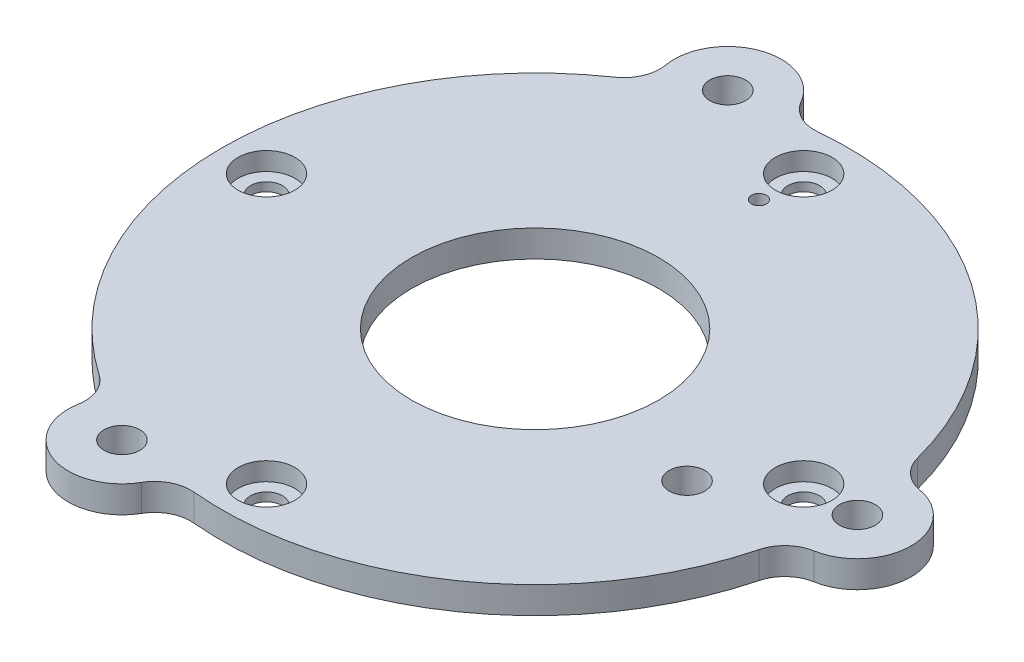
ISO-10303-21;
HEADER;
FILE_DESCRIPTION(('STEP AP214'),'2;1');
FILE_NAME('part.step','',(''),(''),'','','');
FILE_SCHEMA(('AUTOMOTIVE_DESIGN { 1 0 10303 214 1 1 1 1 }'));
ENDSEC;
DATA;
#1=APPLICATION_CONTEXT('core data for automotive mechanical design processes');
#2=APPLICATION_PROTOCOL_DEFINITION('international standard','automotive_design',2000,#1);
#3=PRODUCT_CONTEXT('',#1,'mechanical');
#4=PRODUCT('Part','Part','',(#3));
#5=PRODUCT_RELATED_PRODUCT_CATEGORY('part','',(#4));
#6=PRODUCT_DEFINITION_FORMATION('','',#4);
#7=PRODUCT_DEFINITION_CONTEXT('part definition',#1,'design');
#8=PRODUCT_DEFINITION('design','',#6,#7);
#9=PRODUCT_DEFINITION_SHAPE('','',#8);
#10=(LENGTH_UNIT() NAMED_UNIT(*) SI_UNIT(.MILLI.,.METRE.));
#11=(NAMED_UNIT(*) PLANE_ANGLE_UNIT() SI_UNIT($,.RADIAN.));
#12=(NAMED_UNIT(*) SI_UNIT($,.STERADIAN.) SOLID_ANGLE_UNIT());
#13=UNCERTAINTY_MEASURE_WITH_UNIT(LENGTH_MEASURE(1.E-05),#10,'distance_accuracy_value','');
#14=(GEOMETRIC_REPRESENTATION_CONTEXT(3) GLOBAL_UNCERTAINTY_ASSIGNED_CONTEXT((#13)) GLOBAL_UNIT_ASSIGNED_CONTEXT((#10,
#11,#12)) REPRESENTATION_CONTEXT('',''));
#15=CARTESIAN_POINT('',(0.,0.,0.));
#16=DIRECTION('',(0.,0.,1.));
#17=DIRECTION('',(1.,0.,0.));
#18=AXIS2_PLACEMENT_3D('',#15,#16,#17);
#19=CARTESIAN_POINT('',(0.,1.5,0.));
#20=DIRECTION('',(0.,-1.,0.));
#21=DIRECTION('',(0.,0.,-1.));
#22=AXIS2_PLACEMENT_3D('',#19,#20,#21);
#23=CYLINDRICAL_SURFACE('',#22,17.5);
#24=CARTESIAN_POINT('',(0.,0.,0.));
#25=DIRECTION('',(0.,1.,0.));
#26=DIRECTION('',(0.,0.,1.));
#27=AXIS2_PLACEMENT_3D('',#24,#25,#26);
#28=CIRCLE('',#27,17.5);
#29=CARTESIAN_POINT('',(-1.63884490753952,0.,17.423093507441));
#30=VERTEX_POINT('',#29);
#31=CARTESIAN_POINT('',(16.9328703703704,0.,4.419038472364));
#32=VERTEX_POINT('',#31);
#33=EDGE_CURVE('E182',#30,#32,#28,.T.);
#34=ORIENTED_EDGE('',*,*,#33,.T.);
#35=DIRECTION('',(0.,-1.,0.));
#36=VECTOR('',#35,1.);
#37=CARTESIAN_POINT('',(16.9328703703704,1.5,4.419038472364));
#38=LINE('',#37,#36);
#39=CARTESIAN_POINT('',(16.9328703703704,1.5,4.419038472364));
#40=VERTEX_POINT('',#39);
#41=EDGE_CURVE('E216',#32,#40,#38,.F.);
#42=ORIENTED_EDGE('',*,*,#41,.T.);
#43=CARTESIAN_POINT('',(0.,1.5,0.));
#44=DIRECTION('',(0.,1.,0.));
#45=DIRECTION('',(0.,0.,1.));
#46=AXIS2_PLACEMENT_3D('',#43,#44,#45);
#47=CIRCLE('',#46,17.5);
#48=CARTESIAN_POINT('',(-1.63884490753952,1.5,17.423093507441));
#49=VERTEX_POINT('',#48);
#50=EDGE_CURVE('E197',#49,#40,#47,.T.);
#51=ORIENTED_EDGE('',*,*,#50,.F.);
#52=DIRECTION('',(0.,-1.,0.));
#53=VECTOR('',#52,1.);
#54=CARTESIAN_POINT('',(-1.63884490753952,1.5,17.423093507441));
#55=LINE('',#54,#53);
#56=EDGE_CURVE('E220',#49,#30,#55,.T.);
#57=ORIENTED_EDGE('',*,*,#56,.T.);
#58=EDGE_LOOP('',(#34,#42,#51,#57));
#59=FACE_BOUND('',#58,.T.);
#60=ADVANCED_FACE('F35',(#59),#23,.T.);
#61=CARTESIAN_POINT('',(-9.94392059443859,0.,-14.4002931640818));
#62=VERTEX_POINT('',#61);
#63=CARTESIAN_POINT('',(-9.9439205944385,0.,14.4002931640818));
#64=VERTEX_POINT('',#63);
#65=EDGE_CURVE('E185',#62,#64,#28,.T.);
#66=ORIENTED_EDGE('',*,*,#65,.T.);
#67=DIRECTION('',(0.,-1.,0.));
#68=VECTOR('',#67,1.);
#69=CARTESIAN_POINT('',(-9.94392059443849,1.5,14.4002931640818));
#70=LINE('',#69,#68);
#71=CARTESIAN_POINT('',(-9.9439205944385,1.5,14.4002931640818));
#72=VERTEX_POINT('',#71);
#73=EDGE_CURVE('E209',#64,#72,#70,.F.);
#74=ORIENTED_EDGE('',*,*,#73,.T.);
#75=CARTESIAN_POINT('',(-9.94392059443859,1.5,-14.4002931640818));
#76=VERTEX_POINT('',#75);
#77=EDGE_CURVE('E135',#76,#72,#47,.T.);
#78=ORIENTED_EDGE('',*,*,#77,.F.);
#79=DIRECTION('',(0.,-1.,0.));
#80=VECTOR('',#79,1.);
#81=CARTESIAN_POINT('',(-9.94392059443859,1.5,-14.4002931640818));
#82=LINE('',#81,#80);
#83=EDGE_CURVE('E218',#76,#62,#82,.T.);
#84=ORIENTED_EDGE('',*,*,#83,.T.);
#85=EDGE_LOOP('',(#66,#74,#78,#84));
#86=FACE_BOUND('',#85,.T.);
#87=ADVANCED_FACE('F313',(#86),#23,.T.);
#88=CARTESIAN_POINT('',(16.9328703703704,0.,-4.419038472364));
#89=VERTEX_POINT('',#88);
#90=CARTESIAN_POINT('',(-1.63884490753963,0.,-17.423093507441));
#91=VERTEX_POINT('',#90);
#92=EDGE_CURVE('E180',#89,#91,#28,.T.);
#93=ORIENTED_EDGE('',*,*,#92,.T.);
#94=DIRECTION('',(0.,-1.,0.));
#95=VECTOR('',#94,1.);
#96=CARTESIAN_POINT('',(-1.63884490753963,1.5,-17.423093507441));
#97=LINE('',#96,#95);
#98=CARTESIAN_POINT('',(-1.63884490753963,1.5,-17.423093507441));
#99=VERTEX_POINT('',#98);
#100=EDGE_CURVE('E51',#91,#99,#97,.F.);
#101=ORIENTED_EDGE('',*,*,#100,.T.);
#102=CARTESIAN_POINT('',(16.9328703703704,1.5,-4.419038472364));
#103=VERTEX_POINT('',#102);
#104=EDGE_CURVE('E192',#103,#99,#47,.T.);
#105=ORIENTED_EDGE('',*,*,#104,.F.);
#106=DIRECTION('',(0.,-1.,0.));
#107=VECTOR('',#106,1.);
#108=CARTESIAN_POINT('',(16.9328703703704,1.5,-4.419038472364));
#109=LINE('',#108,#107);
#110=EDGE_CURVE('E148',#103,#89,#109,.T.);
#111=ORIENTED_EDGE('',*,*,#110,.T.);
#112=EDGE_LOOP('',(#93,#101,#105,#111));
#113=FACE_BOUND('',#112,.T.);
#114=ADVANCED_FACE('F304',(#113),#23,.T.);
#115=CARTESIAN_POINT('',(0.,1.5,0.));
#116=DIRECTION('',(0.,1.,0.));
#117=DIRECTION('',(0.,0.,1.));
#118=AXIS2_PLACEMENT_3D('',#115,#116,#117);
#119=PLANE('',#118);
#120=CARTESIAN_POINT('',(0.,1.5,0.));
#121=DIRECTION('',(0.,1.,0.));
#122=DIRECTION('',(0.,0.,1.));
#123=AXIS2_PLACEMENT_3D('',#120,#121,#122);
#124=CIRCLE('',#123,6.9);
#125=CARTESIAN_POINT('',(0.,1.5,6.9));
#126=VERTEX_POINT('',#125);
#127=EDGE_CURVE('E697',#126,#126,#124,.T.);
#128=ORIENTED_EDGE('',*,*,#127,.F.);
#129=EDGE_LOOP('',(#128));
#130=FACE_BOUND('',#129,.T.);
#131=CARTESIAN_POINT('',(-6.15636257986211,1.5,-16.9144671741463));
#132=DIRECTION('',(0.,1.,0.));
#133=DIRECTION('',(0.,0.,1.));
#134=AXIS2_PLACEMENT_3D('',#131,#132,#133);
#135=CIRCLE('',#134,1.);
#136=CARTESIAN_POINT('',(-6.15636257986211,1.5,-15.9144671741463));
#137=VERTEX_POINT('',#136);
#138=EDGE_CURVE('E235',#137,#137,#135,.F.);
#139=ORIENTED_EDGE('',*,*,#138,.T.);
#140=EDGE_LOOP('',(#139));
#141=FACE_BOUND('',#140,.T.);
#142=CARTESIAN_POINT('',(18.,1.5,0.));
#143=DIRECTION('',(0.,1.,0.));
#144=DIRECTION('',(0.,0.,1.));
#145=AXIS2_PLACEMENT_3D('',#142,#143,#144);
#146=CIRCLE('',#145,1.);
#147=CARTESIAN_POINT('',(18.,1.5,1.));
#148=VERTEX_POINT('',#147);
#149=EDGE_CURVE('E344',#148,#148,#146,.F.);
#150=ORIENTED_EDGE('',*,*,#149,.T.);
#151=EDGE_LOOP('',(#150));
#152=FACE_BOUND('',#151,.T.);
#153=CARTESIAN_POINT('',(-6.15636257986199,1.5,16.9144671741464));
#154=DIRECTION('',(0.,1.,0.));
#155=DIRECTION('',(0.,0.,1.));
#156=AXIS2_PLACEMENT_3D('',#153,#154,#155);
#157=CIRCLE('',#156,1.);
#158=CARTESIAN_POINT('',(-6.15636257986199,1.5,17.9144671741464));
#159=VERTEX_POINT('',#158);
#160=EDGE_CURVE('E144',#159,#159,#157,.F.);
#161=ORIENTED_EDGE('',*,*,#160,.T.);
#162=EDGE_LOOP('',(#161));
#163=FACE_BOUND('',#162,.T.);
#164=CARTESIAN_POINT('',(-6.15636257986199,1.5,16.9144671741464));
#165=DIRECTION('',(0.,1.,0.));
#166=DIRECTION('',(0.,0.,1.));
#167=AXIS2_PLACEMENT_3D('',#164,#165,#166);
#168=CIRCLE('',#167,3.);
#169=CARTESIAN_POINT('',(-3.5582299129855,1.5,18.4143693860619));
#170=VERTEX_POINT('',#169);
#171=CARTESIAN_POINT('',(-9.11076622936939,1.5,16.3934114422161));
#172=VERTEX_POINT('',#171);
#173=EDGE_CURVE('E353',#170,#172,#168,.F.);
#174=ORIENTED_EDGE('',*,*,#173,.F.);
#175=CARTESIAN_POINT('',(-1.82614146840118,1.5,19.4143041940057));
#176=DIRECTION('',(0.,1.,0.));
#177=DIRECTION('',(0.,0.,1.));
#178=AXIS2_PLACEMENT_3D('',#175,#176,#177);
#179=CIRCLE('',#178,2.);
#180=EDGE_CURVE('E162',#170,#49,#179,.F.);
#181=ORIENTED_EDGE('',*,*,#180,.T.);
#182=ORIENTED_EDGE('',*,*,#50,.T.);
#183=CARTESIAN_POINT('',(18.8680555555556,1.5,4.92407144063417));
#184=DIRECTION('',(0.,1.,0.));
#185=DIRECTION('',(0.,0.,1.));
#186=AXIS2_PLACEMENT_3D('',#183,#184,#185);
#187=CIRCLE('',#186,2.);
#188=CARTESIAN_POINT('',(18.5208333333333,1.5,2.9544428643805));
#189=VERTEX_POINT('',#188);
#190=EDGE_CURVE('E142',#40,#189,#187,.F.);
#191=ORIENTED_EDGE('',*,*,#190,.T.);
#192=CARTESIAN_POINT('',(18.,1.5,0.));
#193=DIRECTION('',(0.,1.,0.));
#194=DIRECTION('',(0.,0.,1.));
#195=AXIS2_PLACEMENT_3D('',#192,#193,#194);
#196=CIRCLE('',#195,3.);
#197=CARTESIAN_POINT('',(18.5208333333333,1.5,-2.9544428643805));
#198=VERTEX_POINT('',#197);
#199=EDGE_CURVE('E129',#198,#189,#196,.F.);
#200=ORIENTED_EDGE('',*,*,#199,.F.);
#201=CARTESIAN_POINT('',(18.8680555555556,1.5,-4.92407144063417));
#202=DIRECTION('',(0.,1.,0.));
#203=DIRECTION('',(0.,0.,1.));
#204=AXIS2_PLACEMENT_3D('',#201,#202,#203);
#205=CIRCLE('',#204,2.);
#206=EDGE_CURVE('E11',#198,#103,#205,.F.);
#207=ORIENTED_EDGE('',*,*,#206,.T.);
#208=ORIENTED_EDGE('',*,*,#104,.T.);
#209=CARTESIAN_POINT('',(-1.8261414684013,1.5,-19.4143041940056));
#210=DIRECTION('',(0.,1.,0.));
#211=DIRECTION('',(0.,0.,1.));
#212=AXIS2_PLACEMENT_3D('',#209,#210,#211);
#213=CIRCLE('',#212,2.);
#214=CARTESIAN_POINT('',(-3.55822991298562,1.5,-18.4143693860619));
#215=VERTEX_POINT('',#214);
#216=EDGE_CURVE('E174',#99,#215,#213,.F.);
#217=ORIENTED_EDGE('',*,*,#216,.T.);
#218=CARTESIAN_POINT('',(-6.15636257986211,1.5,-16.9144671741463));
#219=DIRECTION('',(0.,1.,0.));
#220=DIRECTION('',(0.,0.,1.));
#221=AXIS2_PLACEMENT_3D('',#218,#219,#220);
#222=CIRCLE('',#221,3.);
#223=CARTESIAN_POINT('',(-9.1107662293695,1.5,-16.3934114422161));
#224=VERTEX_POINT('',#223);
#225=EDGE_CURVE('E233',#224,#215,#222,.F.);
#226=ORIENTED_EDGE('',*,*,#225,.F.);
#227=CARTESIAN_POINT('',(-11.0803686623744,1.5,-16.0460409542625));
#228=DIRECTION('',(0.,1.,0.));
#229=DIRECTION('',(0.,0.,1.));
#230=AXIS2_PLACEMENT_3D('',#227,#228,#229);
#231=CIRCLE('',#230,2.);
#232=EDGE_CURVE('E170',#224,#76,#231,.F.);
#233=ORIENTED_EDGE('',*,*,#232,.T.);
#234=ORIENTED_EDGE('',*,*,#77,.T.);
#235=CARTESIAN_POINT('',(-11.0803686623743,1.5,16.0460409542626));
#236=DIRECTION('',(0.,1.,0.));
#237=DIRECTION('',(0.,0.,1.));
#238=AXIS2_PLACEMENT_3D('',#235,#236,#237);
#239=CIRCLE('',#238,2.);
#240=EDGE_CURVE('E166',#72,#172,#239,.F.);
#241=ORIENTED_EDGE('',*,*,#240,.T.);
#242=EDGE_LOOP('',(#174,#181,#182,#191,#200,#207,#208,#217,#226,#233,#234,#241));
#243=FACE_BOUND('',#242,.T.);
#244=CARTESIAN_POINT('',(0.,1.5,-15.));
#245=DIRECTION('',(0.,1.,0.));
#246=DIRECTION('',(0.,0.,1.));
#247=AXIS2_PLACEMENT_3D('',#244,#245,#246);
#248=CIRCLE('',#247,1.5875);
#249=CARTESIAN_POINT('',(0.,1.5,-13.4125));
#250=VERTEX_POINT('',#249);
#251=EDGE_CURVE('E239',#250,#250,#248,.T.);
#252=ORIENTED_EDGE('',*,*,#251,.F.);
#253=EDGE_LOOP('',(#252));
#254=FACE_BOUND('',#253,.T.);
#255=CARTESIAN_POINT('',(-15.,1.5,0.));
#256=DIRECTION('',(0.,1.,0.));
#257=DIRECTION('',(0.,0.,1.));
#258=AXIS2_PLACEMENT_3D('',#255,#256,#257);
#259=CIRCLE('',#258,1.5875);
#260=CARTESIAN_POINT('',(-15.,1.5,1.5875));
#261=VERTEX_POINT('',#260);
#262=EDGE_CURVE('E255',#261,#261,#259,.T.);
#263=ORIENTED_EDGE('',*,*,#262,.F.);
#264=EDGE_LOOP('',(#263));
#265=FACE_BOUND('',#264,.T.);
#266=CARTESIAN_POINT('',(0.,1.5,15.));
#267=DIRECTION('',(0.,1.,0.));
#268=DIRECTION('',(0.,0.,1.));
#269=AXIS2_PLACEMENT_3D('',#266,#267,#268);
#270=CIRCLE('',#269,1.5875);
#271=CARTESIAN_POINT('',(0.,1.5,16.5875));
#272=VERTEX_POINT('',#271);
#273=EDGE_CURVE('E267',#272,#272,#270,.T.);
#274=ORIENTED_EDGE('',*,*,#273,.F.);
#275=EDGE_LOOP('',(#274));
#276=FACE_BOUND('',#275,.T.);
#277=CARTESIAN_POINT('',(15.,1.5,0.));
#278=DIRECTION('',(0.,1.,0.));
#279=DIRECTION('',(0.,0.,1.));
#280=AXIS2_PLACEMENT_3D('',#277,#278,#279);
#281=CIRCLE('',#280,1.5875);
#282=CARTESIAN_POINT('',(15.,1.5,1.5875));
#283=VERTEX_POINT('',#282);
#284=EDGE_CURVE('E279',#283,#283,#281,.T.);
#285=ORIENTED_EDGE('',*,*,#284,.F.);
#286=EDGE_LOOP('',(#285));
#287=FACE_BOUND('',#286,.T.);
#288=CARTESIAN_POINT('',(0.,1.5,-12.5));
#289=DIRECTION('',(0.,1.,0.));
#290=DIRECTION('',(0.,0.,1.));
#291=AXIS2_PLACEMENT_3D('',#288,#289,#290);
#292=CIRCLE('',#291,0.42);
#293=CARTESIAN_POINT('',(0.,1.5,-12.08));
#294=VERTEX_POINT('',#293);
#295=EDGE_CURVE('E183',#294,#294,#292,.T.);
#296=ORIENTED_EDGE('',*,*,#295,.F.);
#297=EDGE_LOOP('',(#296));
#298=FACE_BOUND('',#297,.T.);
#299=CARTESIAN_POINT('',(11.5911099154688,1.5,3.10582854123026));
#300=DIRECTION('',(0.,1.,0.));
#301=DIRECTION('',(0.,0.,1.));
#302=AXIS2_PLACEMENT_3D('',#299,#300,#301);
#303=CIRCLE('',#302,1.);
#304=CARTESIAN_POINT('',(11.5911099154688,1.5,4.10582854123026));
#305=VERTEX_POINT('',#304);
#306=EDGE_CURVE('E188',#305,#305,#303,.T.);
#307=ORIENTED_EDGE('',*,*,#306,.F.);
#308=EDGE_LOOP('',(#307));
#309=FACE_BOUND('',#308,.T.);
#310=ADVANCED_FACE('F138',(#130,#141,#152,#163,#243,#254,#265,#276,#287,#298,#309),#119,.T.);
#311=CARTESIAN_POINT('',(0.,0.,0.));
#312=DIRECTION('',(0.,1.,0.));
#313=DIRECTION('',(0.,0.,1.));
#314=AXIS2_PLACEMENT_3D('',#311,#312,#313);
#315=PLANE('',#314);
#316=CARTESIAN_POINT('',(0.,0.,0.));
#317=DIRECTION('',(0.,1.,0.));
#318=DIRECTION('',(0.,0.,1.));
#319=AXIS2_PLACEMENT_3D('',#316,#317,#318);
#320=CIRCLE('',#319,6.9);
#321=CARTESIAN_POINT('',(0.,0.,6.9));
#322=VERTEX_POINT('',#321);
#323=EDGE_CURVE('E39',#322,#322,#320,.T.);
#324=ORIENTED_EDGE('',*,*,#323,.T.);
#325=EDGE_LOOP('',(#324));
#326=FACE_BOUND('',#325,.T.);
#327=CARTESIAN_POINT('',(-6.15636257986199,0.,16.9144671741464));
#328=DIRECTION('',(0.,-1.,0.));
#329=DIRECTION('',(0.,0.,-1.));
#330=AXIS2_PLACEMENT_3D('',#327,#328,#329);
#331=CIRCLE('',#330,1.);
#332=CARTESIAN_POINT('',(-6.15636257986199,0.,15.9144671741464));
#333=VERTEX_POINT('',#332);
#334=EDGE_CURVE('E348',#333,#333,#331,.T.);
#335=ORIENTED_EDGE('',*,*,#334,.F.);
#336=EDGE_LOOP('',(#335));
#337=FACE_BOUND('',#336,.T.);
#338=ORIENTED_EDGE('',*,*,#33,.F.);
#339=CARTESIAN_POINT('',(-1.82614146840118,0.,19.4143041940057));
#340=DIRECTION('',(0.,1.,0.));
#341=DIRECTION('',(0.,0.,1.));
#342=AXIS2_PLACEMENT_3D('',#339,#340,#341);
#343=CIRCLE('',#342,2.);
#344=CARTESIAN_POINT('',(-3.5582299129855,0.,18.4143693860619));
#345=VERTEX_POINT('',#344);
#346=EDGE_CURVE('E160',#30,#345,#343,.T.);
#347=ORIENTED_EDGE('',*,*,#346,.T.);
#348=CARTESIAN_POINT('',(-6.15636257986199,0.,16.9144671741464));
#349=DIRECTION('',(0.,-1.,0.));
#350=DIRECTION('',(0.,0.,-1.));
#351=AXIS2_PLACEMENT_3D('',#348,#349,#350);
#352=CIRCLE('',#351,3.);
#353=CARTESIAN_POINT('',(-9.11076622936939,0.,16.3934114422161));
#354=VERTEX_POINT('',#353);
#355=EDGE_CURVE('E346',#345,#354,#352,.T.);
#356=ORIENTED_EDGE('',*,*,#355,.T.);
#357=CARTESIAN_POINT('',(-11.0803686623743,0.,16.0460409542626));
#358=DIRECTION('',(0.,1.,0.));
#359=DIRECTION('',(0.,0.,1.));
#360=AXIS2_PLACEMENT_3D('',#357,#358,#359);
#361=CIRCLE('',#360,2.);
#362=EDGE_CURVE('E164',#354,#64,#361,.T.);
#363=ORIENTED_EDGE('',*,*,#362,.T.);
#364=ORIENTED_EDGE('',*,*,#65,.F.);
#365=CARTESIAN_POINT('',(-11.0803686623744,0.,-16.0460409542625));
#366=DIRECTION('',(0.,1.,0.));
#367=DIRECTION('',(0.,0.,1.));
#368=AXIS2_PLACEMENT_3D('',#365,#366,#367);
#369=CIRCLE('',#368,2.);
#370=CARTESIAN_POINT('',(-9.1107662293695,0.,-16.3934114422161));
#371=VERTEX_POINT('',#370);
#372=EDGE_CURVE('E168',#62,#371,#369,.T.);
#373=ORIENTED_EDGE('',*,*,#372,.T.);
#374=CARTESIAN_POINT('',(-6.15636257986211,0.,-16.9144671741463));
#375=DIRECTION('',(0.,-1.,0.));
#376=DIRECTION('',(0.,0.,-1.));
#377=AXIS2_PLACEMENT_3D('',#374,#375,#376);
#378=CIRCLE('',#377,3.);
#379=CARTESIAN_POINT('',(-3.55822991298562,0.,-18.4143693860619));
#380=VERTEX_POINT('',#379);
#381=EDGE_CURVE('E231',#371,#380,#378,.T.);
#382=ORIENTED_EDGE('',*,*,#381,.T.);
#383=CARTESIAN_POINT('',(-1.8261414684013,0.,-19.4143041940056));
#384=DIRECTION('',(0.,1.,0.));
#385=DIRECTION('',(0.,0.,1.));
#386=AXIS2_PLACEMENT_3D('',#383,#384,#385);
#387=CIRCLE('',#386,2.);
#388=EDGE_CURVE('E172',#380,#91,#387,.T.);
#389=ORIENTED_EDGE('',*,*,#388,.T.);
#390=ORIENTED_EDGE('',*,*,#92,.F.);
#391=CARTESIAN_POINT('',(18.8680555555556,0.,-4.92407144063417));
#392=DIRECTION('',(0.,1.,0.));
#393=DIRECTION('',(0.,0.,1.));
#394=AXIS2_PLACEMENT_3D('',#391,#392,#393);
#395=CIRCLE('',#394,2.);
#396=CARTESIAN_POINT('',(18.5208333333333,0.,-2.9544428643805));
#397=VERTEX_POINT('',#396);
#398=EDGE_CURVE('E44',#89,#397,#395,.T.);
#399=ORIENTED_EDGE('',*,*,#398,.T.);
#400=CARTESIAN_POINT('',(18.,0.,0.));
#401=DIRECTION('',(0.,-1.,0.));
#402=DIRECTION('',(0.,0.,-1.));
#403=AXIS2_PLACEMENT_3D('',#400,#401,#402);
#404=CIRCLE('',#403,3.);
#405=CARTESIAN_POINT('',(18.5208333333333,0.,2.9544428643805));
#406=VERTEX_POINT('',#405);
#407=EDGE_CURVE('E132',#397,#406,#404,.T.);
#408=ORIENTED_EDGE('',*,*,#407,.T.);
#409=CARTESIAN_POINT('',(18.8680555555556,0.,4.92407144063417));
#410=DIRECTION('',(0.,1.,0.));
#411=DIRECTION('',(0.,0.,1.));
#412=AXIS2_PLACEMENT_3D('',#409,#410,#411);
#413=CIRCLE('',#412,2.);
#414=EDGE_CURVE('E152',#406,#32,#413,.T.);
#415=ORIENTED_EDGE('',*,*,#414,.T.);
#416=EDGE_LOOP('',(#338,#347,#356,#363,#364,#373,#382,#389,#390,#399,#408,#415));
#417=FACE_BOUND('',#416,.T.);
#418=CARTESIAN_POINT('',(-6.15636257986211,0.,-16.9144671741463));
#419=DIRECTION('',(0.,-1.,0.));
#420=DIRECTION('',(0.,0.,-1.));
#421=AXIS2_PLACEMENT_3D('',#418,#419,#420);
#422=CIRCLE('',#421,1.);
#423=CARTESIAN_POINT('',(-6.15636257986211,0.,-17.9144671741463));
#424=VERTEX_POINT('',#423);
#425=EDGE_CURVE('E236',#424,#424,#422,.T.);
#426=ORIENTED_EDGE('',*,*,#425,.F.);
#427=EDGE_LOOP('',(#426));
#428=FACE_BOUND('',#427,.T.);
#429=CARTESIAN_POINT('',(0.,0.,-15.));
#430=DIRECTION('',(0.,1.,0.));
#431=DIRECTION('',(0.,0.,1.));
#432=AXIS2_PLACEMENT_3D('',#429,#430,#431);
#433=CIRCLE('',#432,0.889);
#434=CARTESIAN_POINT('',(0.,0.,-14.111));
#435=VERTEX_POINT('',#434);
#436=EDGE_CURVE('E252',#435,#435,#433,.T.);
#437=ORIENTED_EDGE('',*,*,#436,.T.);
#438=EDGE_LOOP('',(#437));
#439=FACE_BOUND('',#438,.T.);
#440=CARTESIAN_POINT('',(-15.,0.,0.));
#441=DIRECTION('',(0.,1.,0.));
#442=DIRECTION('',(0.,0.,1.));
#443=AXIS2_PLACEMENT_3D('',#440,#441,#442);
#444=CIRCLE('',#443,0.888999999999999);
#445=CARTESIAN_POINT('',(-15.,0.,0.888999999999999));
#446=VERTEX_POINT('',#445);
#447=EDGE_CURVE('E264',#446,#446,#444,.T.);
#448=ORIENTED_EDGE('',*,*,#447,.T.);
#449=EDGE_LOOP('',(#448));
#450=FACE_BOUND('',#449,.T.);
#451=CARTESIAN_POINT('',(0.,0.,15.));
#452=DIRECTION('',(0.,1.,0.));
#453=DIRECTION('',(0.,0.,1.));
#454=AXIS2_PLACEMENT_3D('',#451,#452,#453);
#455=CIRCLE('',#454,0.889);
#456=CARTESIAN_POINT('',(0.,0.,15.889));
#457=VERTEX_POINT('',#456);
#458=EDGE_CURVE('E276',#457,#457,#455,.T.);
#459=ORIENTED_EDGE('',*,*,#458,.T.);
#460=EDGE_LOOP('',(#459));
#461=FACE_BOUND('',#460,.T.);
#462=CARTESIAN_POINT('',(15.,0.,0.));
#463=DIRECTION('',(0.,1.,0.));
#464=DIRECTION('',(0.,0.,1.));
#465=AXIS2_PLACEMENT_3D('',#462,#463,#464);
#466=CIRCLE('',#465,0.889000000000001);
#467=CARTESIAN_POINT('',(15.,0.,0.889000000000001));
#468=VERTEX_POINT('',#467);
#469=EDGE_CURVE('E288',#468,#468,#466,.T.);
#470=ORIENTED_EDGE('',*,*,#469,.T.);
#471=EDGE_LOOP('',(#470));
#472=FACE_BOUND('',#471,.T.);
#473=CARTESIAN_POINT('',(0.,0.,-12.5));
#474=DIRECTION('',(0.,1.,0.));
#475=DIRECTION('',(0.,0.,1.));
#476=AXIS2_PLACEMENT_3D('',#473,#474,#475);
#477=CIRCLE('',#476,0.42);
#478=CARTESIAN_POINT('',(0.,0.,-12.08));
#479=VERTEX_POINT('',#478);
#480=EDGE_CURVE('E292',#479,#479,#477,.T.);
#481=ORIENTED_EDGE('',*,*,#480,.T.);
#482=EDGE_LOOP('',(#481));
#483=FACE_BOUND('',#482,.T.);
#484=CARTESIAN_POINT('',(11.5911099154688,0.,3.10582854123026));
#485=DIRECTION('',(0.,1.,0.));
#486=DIRECTION('',(0.,0.,1.));
#487=AXIS2_PLACEMENT_3D('',#484,#485,#486);
#488=CIRCLE('',#487,1.);
#489=CARTESIAN_POINT('',(11.5911099154688,0.,4.10582854123026));
#490=VERTEX_POINT('',#489);
#491=EDGE_CURVE('E291',#490,#490,#488,.T.);
#492=ORIENTED_EDGE('',*,*,#491,.T.);
#493=EDGE_LOOP('',(#492));
#494=FACE_BOUND('',#493,.T.);
#495=CARTESIAN_POINT('',(18.,0.,0.));
#496=DIRECTION('',(0.,-1.,0.));
#497=DIRECTION('',(0.,0.,-1.));
#498=AXIS2_PLACEMENT_3D('',#495,#496,#497);
#499=CIRCLE('',#498,1.);
#500=CARTESIAN_POINT('',(18.,0.,-1.));
#501=VERTEX_POINT('',#500);
#502=EDGE_CURVE('E143',#501,#501,#499,.T.);
#503=ORIENTED_EDGE('',*,*,#502,.F.);
#504=EDGE_LOOP('',(#503));
#505=FACE_BOUND('',#504,.T.);
#506=ADVANCED_FACE('F178',(#326,#337,#417,#428,#439,#450,#461,#472,#483,#494,#505),#315,.F.);
#507=CARTESIAN_POINT('',(11.5911099154688,0.,3.10582854123026));
#508=DIRECTION('',(0.,1.,0.));
#509=DIRECTION('',(0.,0.,1.));
#510=AXIS2_PLACEMENT_3D('',#507,#508,#509);
#511=CYLINDRICAL_SURFACE('',#510,1.);
#512=ORIENTED_EDGE('',*,*,#306,.T.);
#513=EDGE_LOOP('',(#512));
#514=FACE_BOUND('',#513,.T.);
#515=ORIENTED_EDGE('',*,*,#491,.F.);
#516=EDGE_LOOP('',(#515));
#517=FACE_BOUND('',#516,.T.);
#518=ADVANCED_FACE('F300',(#514,#517),#511,.F.);
#519=CARTESIAN_POINT('',(0.,0.,-12.5));
#520=DIRECTION('',(0.,1.,0.));
#521=DIRECTION('',(0.,0.,1.));
#522=AXIS2_PLACEMENT_3D('',#519,#520,#521);
#523=CYLINDRICAL_SURFACE('',#522,0.42);
#524=ORIENTED_EDGE('',*,*,#295,.T.);
#525=EDGE_LOOP('',(#524));
#526=FACE_BOUND('',#525,.T.);
#527=ORIENTED_EDGE('',*,*,#480,.F.);
#528=EDGE_LOOP('',(#527));
#529=FACE_BOUND('',#528,.T.);
#530=ADVANCED_FACE('F433',(#526,#529),#523,.F.);
#531=CARTESIAN_POINT('',(15.,1.5,0.));
#532=DIRECTION('',(0.,1.,0.));
#533=DIRECTION('',(0.,0.,1.));
#534=AXIS2_PLACEMENT_3D('',#531,#532,#533);
#535=CYLINDRICAL_SURFACE('',#534,0.889000000000001);
#536=ORIENTED_EDGE('',*,*,#469,.F.);
#537=EDGE_LOOP('',(#536));
#538=FACE_BOUND('',#537,.T.);
#539=CARTESIAN_POINT('',(15.,0.484,0.));
#540=DIRECTION('',(0.,1.,0.));
#541=DIRECTION('',(0.,0.,1.));
#542=AXIS2_PLACEMENT_3D('',#539,#540,#541);
#543=CIRCLE('',#542,0.889000000000001);
#544=CARTESIAN_POINT('',(15.,0.484,0.889000000000001));
#545=VERTEX_POINT('',#544);
#546=EDGE_CURVE('E285',#545,#545,#543,.T.);
#547=ORIENTED_EDGE('',*,*,#546,.T.);
#548=EDGE_LOOP('',(#547));
#549=FACE_BOUND('',#548,.T.);
#550=ADVANCED_FACE('F429',(#538,#549),#535,.F.);
#551=CARTESIAN_POINT('',(15.889,0.484,0.));
#552=DIRECTION('',(0.,-1.,0.));
#553=DIRECTION('',(0.,0.,-1.));
#554=AXIS2_PLACEMENT_3D('',#551,#552,#553);
#555=PLANE('',#554);
#556=ORIENTED_EDGE('',*,*,#546,.F.);
#557=EDGE_LOOP('',(#556));
#558=FACE_BOUND('',#557,.T.);
#559=CARTESIAN_POINT('',(15.,0.484,0.));
#560=DIRECTION('',(0.,1.,0.));
#561=DIRECTION('',(0.,0.,1.));
#562=AXIS2_PLACEMENT_3D('',#559,#560,#561);
#563=CIRCLE('',#562,1.5875);
#564=CARTESIAN_POINT('',(15.,0.484,1.5875));
#565=VERTEX_POINT('',#564);
#566=EDGE_CURVE('E282',#565,#565,#563,.T.);
#567=ORIENTED_EDGE('',*,*,#566,.T.);
#568=EDGE_LOOP('',(#567));
#569=FACE_BOUND('',#568,.T.);
#570=ADVANCED_FACE('F425',(#558,#569),#555,.F.);
#571=CARTESIAN_POINT('',(15.,1.5,0.));
#572=DIRECTION('',(0.,1.,0.));
#573=DIRECTION('',(0.,0.,1.));
#574=AXIS2_PLACEMENT_3D('',#571,#572,#573);
#575=CYLINDRICAL_SURFACE('',#574,1.5875);
#576=ORIENTED_EDGE('',*,*,#566,.F.);
#577=EDGE_LOOP('',(#576));
#578=FACE_BOUND('',#577,.T.);
#579=ORIENTED_EDGE('',*,*,#284,.T.);
#580=EDGE_LOOP('',(#579));
#581=FACE_BOUND('',#580,.T.);
#582=ADVANCED_FACE('F421',(#578,#581),#575,.F.);
#583=CARTESIAN_POINT('',(0.,1.5,15.));
#584=DIRECTION('',(0.,1.,0.));
#585=DIRECTION('',(0.,0.,1.));
#586=AXIS2_PLACEMENT_3D('',#583,#584,#585);
#587=CYLINDRICAL_SURFACE('',#586,0.889);
#588=ORIENTED_EDGE('',*,*,#458,.F.);
#589=EDGE_LOOP('',(#588));
#590=FACE_BOUND('',#589,.T.);
#591=CARTESIAN_POINT('',(0.,0.484,15.));
#592=DIRECTION('',(0.,1.,0.));
#593=DIRECTION('',(0.,0.,1.));
#594=AXIS2_PLACEMENT_3D('',#591,#592,#593);
#595=CIRCLE('',#594,0.889);
#596=CARTESIAN_POINT('',(0.,0.484,15.889));
#597=VERTEX_POINT('',#596);
#598=EDGE_CURVE('E273',#597,#597,#595,.T.);
#599=ORIENTED_EDGE('',*,*,#598,.T.);
#600=EDGE_LOOP('',(#599));
#601=FACE_BOUND('',#600,.T.);
#602=ADVANCED_FACE('F417',(#590,#601),#587,.F.);
#603=CARTESIAN_POINT('',(0.889,0.484,15.));
#604=DIRECTION('',(0.,-1.,0.));
#605=DIRECTION('',(0.,0.,-1.));
#606=AXIS2_PLACEMENT_3D('',#603,#604,#605);
#607=PLANE('',#606);
#608=ORIENTED_EDGE('',*,*,#598,.F.);
#609=EDGE_LOOP('',(#608));
#610=FACE_BOUND('',#609,.T.);
#611=CARTESIAN_POINT('',(0.,0.484,15.));
#612=DIRECTION('',(0.,1.,0.));
#613=DIRECTION('',(0.,0.,1.));
#614=AXIS2_PLACEMENT_3D('',#611,#612,#613);
#615=CIRCLE('',#614,1.5875);
#616=CARTESIAN_POINT('',(0.,0.484,16.5875));
#617=VERTEX_POINT('',#616);
#618=EDGE_CURVE('E270',#617,#617,#615,.T.);
#619=ORIENTED_EDGE('',*,*,#618,.T.);
#620=EDGE_LOOP('',(#619));
#621=FACE_BOUND('',#620,.T.);
#622=ADVANCED_FACE('F413',(#610,#621),#607,.F.);
#623=CARTESIAN_POINT('',(0.,1.5,15.));
#624=DIRECTION('',(0.,1.,0.));
#625=DIRECTION('',(0.,0.,1.));
#626=AXIS2_PLACEMENT_3D('',#623,#624,#625);
#627=CYLINDRICAL_SURFACE('',#626,1.5875);
#628=ORIENTED_EDGE('',*,*,#618,.F.);
#629=EDGE_LOOP('',(#628));
#630=FACE_BOUND('',#629,.T.);
#631=ORIENTED_EDGE('',*,*,#273,.T.);
#632=EDGE_LOOP('',(#631));
#633=FACE_BOUND('',#632,.T.);
#634=ADVANCED_FACE('F409',(#630,#633),#627,.F.);
#635=CARTESIAN_POINT('',(-15.,1.5,0.));
#636=DIRECTION('',(0.,1.,0.));
#637=DIRECTION('',(0.,0.,1.));
#638=AXIS2_PLACEMENT_3D('',#635,#636,#637);
#639=CYLINDRICAL_SURFACE('',#638,0.888999999999999);
#640=ORIENTED_EDGE('',*,*,#447,.F.);
#641=EDGE_LOOP('',(#640));
#642=FACE_BOUND('',#641,.T.);
#643=CARTESIAN_POINT('',(-15.,0.484,0.));
#644=DIRECTION('',(0.,1.,0.));
#645=DIRECTION('',(0.,0.,1.));
#646=AXIS2_PLACEMENT_3D('',#643,#644,#645);
#647=CIRCLE('',#646,0.888999999999999);
#648=CARTESIAN_POINT('',(-15.,0.484,0.888999999999999));
#649=VERTEX_POINT('',#648);
#650=EDGE_CURVE('E261',#649,#649,#647,.T.);
#651=ORIENTED_EDGE('',*,*,#650,.T.);
#652=EDGE_LOOP('',(#651));
#653=FACE_BOUND('',#652,.T.);
#654=ADVANCED_FACE('F405',(#642,#653),#639,.F.);
#655=CARTESIAN_POINT('',(-14.111,0.484,0.));
#656=DIRECTION('',(0.,-1.,0.));
#657=DIRECTION('',(0.,0.,-1.));
#658=AXIS2_PLACEMENT_3D('',#655,#656,#657);
#659=PLANE('',#658);
#660=ORIENTED_EDGE('',*,*,#650,.F.);
#661=EDGE_LOOP('',(#660));
#662=FACE_BOUND('',#661,.T.);
#663=CARTESIAN_POINT('',(-15.,0.484,0.));
#664=DIRECTION('',(0.,1.,0.));
#665=DIRECTION('',(0.,0.,1.));
#666=AXIS2_PLACEMENT_3D('',#663,#664,#665);
#667=CIRCLE('',#666,1.5875);
#668=CARTESIAN_POINT('',(-15.,0.484,1.5875));
#669=VERTEX_POINT('',#668);
#670=EDGE_CURVE('E258',#669,#669,#667,.T.);
#671=ORIENTED_EDGE('',*,*,#670,.T.);
#672=EDGE_LOOP('',(#671));
#673=FACE_BOUND('',#672,.T.);
#674=ADVANCED_FACE('F401',(#662,#673),#659,.F.);
#675=CARTESIAN_POINT('',(-15.,1.5,0.));
#676=DIRECTION('',(0.,1.,0.));
#677=DIRECTION('',(0.,0.,1.));
#678=AXIS2_PLACEMENT_3D('',#675,#676,#677);
#679=CYLINDRICAL_SURFACE('',#678,1.5875);
#680=ORIENTED_EDGE('',*,*,#670,.F.);
#681=EDGE_LOOP('',(#680));
#682=FACE_BOUND('',#681,.T.);
#683=ORIENTED_EDGE('',*,*,#262,.T.);
#684=EDGE_LOOP('',(#683));
#685=FACE_BOUND('',#684,.T.);
#686=ADVANCED_FACE('F397',(#682,#685),#679,.F.);
#687=CARTESIAN_POINT('',(0.,1.5,-15.));
#688=DIRECTION('',(0.,1.,0.));
#689=DIRECTION('',(0.,0.,1.));
#690=AXIS2_PLACEMENT_3D('',#687,#688,#689);
#691=CYLINDRICAL_SURFACE('',#690,0.889);
#692=ORIENTED_EDGE('',*,*,#436,.F.);
#693=EDGE_LOOP('',(#692));
#694=FACE_BOUND('',#693,.T.);
#695=CARTESIAN_POINT('',(0.,0.484,-15.));
#696=DIRECTION('',(0.,1.,0.));
#697=DIRECTION('',(0.,0.,1.));
#698=AXIS2_PLACEMENT_3D('',#695,#696,#697);
#699=CIRCLE('',#698,0.889);
#700=CARTESIAN_POINT('',(0.,0.484,-14.111));
#701=VERTEX_POINT('',#700);
#702=EDGE_CURVE('E249',#701,#701,#699,.T.);
#703=ORIENTED_EDGE('',*,*,#702,.T.);
#704=EDGE_LOOP('',(#703));
#705=FACE_BOUND('',#704,.T.);
#706=ADVANCED_FACE('F393',(#694,#705),#691,.F.);
#707=CARTESIAN_POINT('',(0.889,0.484,-15.));
#708=DIRECTION('',(0.,-1.,0.));
#709=DIRECTION('',(0.,0.,-1.));
#710=AXIS2_PLACEMENT_3D('',#707,#708,#709);
#711=PLANE('',#710);
#712=ORIENTED_EDGE('',*,*,#702,.F.);
#713=EDGE_LOOP('',(#712));
#714=FACE_BOUND('',#713,.T.);
#715=CARTESIAN_POINT('',(0.,0.484,-15.));
#716=DIRECTION('',(0.,1.,0.));
#717=DIRECTION('',(0.,0.,1.));
#718=AXIS2_PLACEMENT_3D('',#715,#716,#717);
#719=CIRCLE('',#718,1.5875);
#720=CARTESIAN_POINT('',(0.,0.484,-13.4125));
#721=VERTEX_POINT('',#720);
#722=EDGE_CURVE('E246',#721,#721,#719,.T.);
#723=ORIENTED_EDGE('',*,*,#722,.T.);
#724=EDGE_LOOP('',(#723));
#725=FACE_BOUND('',#724,.T.);
#726=ADVANCED_FACE('F389',(#714,#725),#711,.F.);
#727=CARTESIAN_POINT('',(0.,1.5,-15.));
#728=DIRECTION('',(0.,1.,0.));
#729=DIRECTION('',(0.,0.,1.));
#730=AXIS2_PLACEMENT_3D('',#727,#728,#729);
#731=CYLINDRICAL_SURFACE('',#730,1.5875);
#732=ORIENTED_EDGE('',*,*,#722,.F.);
#733=EDGE_LOOP('',(#732));
#734=FACE_BOUND('',#733,.T.);
#735=ORIENTED_EDGE('',*,*,#251,.T.);
#736=EDGE_LOOP('',(#735));
#737=FACE_BOUND('',#736,.T.);
#738=ADVANCED_FACE('F385',(#734,#737),#731,.F.);
#739=CARTESIAN_POINT('',(-6.15636257986211,10.0336895217199,-16.9144671741463));
#740=DIRECTION('',(0.,-1.,0.));
#741=DIRECTION('',(0.,0.,-1.));
#742=AXIS2_PLACEMENT_3D('',#739,#740,#741);
#743=CYLINDRICAL_SURFACE('',#742,1.);
#744=ORIENTED_EDGE('',*,*,#138,.F.);
#745=EDGE_LOOP('',(#744));
#746=FACE_BOUND('',#745,.T.);
#747=ORIENTED_EDGE('',*,*,#425,.T.);
#748=EDGE_LOOP('',(#747));
#749=FACE_BOUND('',#748,.T.);
#750=ADVANCED_FACE('F382',(#746,#749),#743,.F.);
#751=CARTESIAN_POINT('',(-6.15636257986211,10.0336895217199,-16.9144671741463));
#752=DIRECTION('',(0.,-1.,0.));
#753=DIRECTION('',(0.,0.,-1.));
#754=AXIS2_PLACEMENT_3D('',#751,#752,#753);
#755=CYLINDRICAL_SURFACE('',#754,3.);
#756=ORIENTED_EDGE('',*,*,#381,.F.);
#757=DIRECTION('',(0.,-1.,0.));
#758=VECTOR('',#757,1.);
#759=CARTESIAN_POINT('',(-9.1107662293695,10.0336895217199,-16.3934114422161));
#760=LINE('',#759,#758);
#761=EDGE_CURVE('E150',#371,#224,#760,.F.);
#762=ORIENTED_EDGE('',*,*,#761,.T.);
#763=ORIENTED_EDGE('',*,*,#225,.T.);
#764=DIRECTION('',(0.,-1.,0.));
#765=VECTOR('',#764,1.);
#766=CARTESIAN_POINT('',(-3.55822991298562,10.0336895217199,-18.4143693860619));
#767=LINE('',#766,#765);
#768=EDGE_CURVE('E154',#215,#380,#767,.T.);
#769=ORIENTED_EDGE('',*,*,#768,.T.);
#770=EDGE_LOOP('',(#756,#762,#763,#769));
#771=FACE_BOUND('',#770,.T.);
#772=ADVANCED_FACE('F230',(#771),#755,.T.);
#773=CARTESIAN_POINT('',(18.,10.0336895217199,0.));
#774=DIRECTION('',(0.,-1.,0.));
#775=DIRECTION('',(0.,0.,-1.));
#776=AXIS2_PLACEMENT_3D('',#773,#774,#775);
#777=CYLINDRICAL_SURFACE('',#776,3.);
#778=ORIENTED_EDGE('',*,*,#199,.T.);
#779=DIRECTION('',(0.,-1.,0.));
#780=VECTOR('',#779,1.);
#781=CARTESIAN_POINT('',(18.5208333333333,10.0336895217199,2.9544428643805));
#782=LINE('',#781,#780);
#783=EDGE_CURVE('E134',#189,#406,#782,.T.);
#784=ORIENTED_EDGE('',*,*,#783,.T.);
#785=ORIENTED_EDGE('',*,*,#407,.F.);
#786=DIRECTION('',(0.,-1.,0.));
#787=VECTOR('',#786,1.);
#788=CARTESIAN_POINT('',(18.5208333333333,10.0336895217199,-2.9544428643805));
#789=LINE('',#788,#787);
#790=EDGE_CURVE('E126',#397,#198,#789,.F.);
#791=ORIENTED_EDGE('',*,*,#790,.T.);
#792=EDGE_LOOP('',(#778,#784,#785,#791));
#793=FACE_BOUND('',#792,.T.);
#794=ADVANCED_FACE('F127',(#793),#777,.T.);
#795=CARTESIAN_POINT('',(18.,10.0336895217199,0.));
#796=DIRECTION('',(0.,-1.,0.));
#797=DIRECTION('',(0.,0.,-1.));
#798=AXIS2_PLACEMENT_3D('',#795,#796,#797);
#799=CYLINDRICAL_SURFACE('',#798,1.);
#800=ORIENTED_EDGE('',*,*,#502,.T.);
#801=EDGE_LOOP('',(#800));
#802=FACE_BOUND('',#801,.T.);
#803=ORIENTED_EDGE('',*,*,#149,.F.);
#804=EDGE_LOOP('',(#803));
#805=FACE_BOUND('',#804,.T.);
#806=ADVANCED_FACE('F366',(#802,#805),#799,.F.);
#807=CARTESIAN_POINT('',(-6.15636257986199,10.0336895217199,16.9144671741464));
#808=DIRECTION('',(0.,-1.,0.));
#809=DIRECTION('',(0.,0.,-1.));
#810=AXIS2_PLACEMENT_3D('',#807,#808,#809);
#811=CYLINDRICAL_SURFACE('',#810,1.);
#812=ORIENTED_EDGE('',*,*,#160,.F.);
#813=EDGE_LOOP('',(#812));
#814=FACE_BOUND('',#813,.T.);
#815=ORIENTED_EDGE('',*,*,#334,.T.);
#816=EDGE_LOOP('',(#815));
#817=FACE_BOUND('',#816,.T.);
#818=ADVANCED_FACE('F368',(#814,#817),#811,.F.);
#819=CARTESIAN_POINT('',(-6.15636257986199,10.0336895217199,16.9144671741464));
#820=DIRECTION('',(0.,-1.,0.));
#821=DIRECTION('',(0.,0.,-1.));
#822=AXIS2_PLACEMENT_3D('',#819,#820,#821);
#823=CYLINDRICAL_SURFACE('',#822,3.);
#824=ORIENTED_EDGE('',*,*,#355,.F.);
#825=DIRECTION('',(0.,-1.,0.));
#826=VECTOR('',#825,1.);
#827=CARTESIAN_POINT('',(-3.5582299129855,10.0336895217199,18.4143693860619));
#828=LINE('',#827,#826);
#829=EDGE_CURVE('E215',#345,#170,#828,.F.);
#830=ORIENTED_EDGE('',*,*,#829,.T.);
#831=ORIENTED_EDGE('',*,*,#173,.T.);
#832=DIRECTION('',(0.,-1.,0.));
#833=VECTOR('',#832,1.);
#834=CARTESIAN_POINT('',(-9.11076622936939,10.0336895217199,16.3934114422161));
#835=LINE('',#834,#833);
#836=EDGE_CURVE('E211',#172,#354,#835,.T.);
#837=ORIENTED_EDGE('',*,*,#836,.T.);
#838=EDGE_LOOP('',(#824,#830,#831,#837));
#839=FACE_BOUND('',#838,.T.);
#840=ADVANCED_FACE('F328',(#839),#823,.T.);
#841=CARTESIAN_POINT('',(18.8680555555556,1.5,4.92407144063417));
#842=DIRECTION('',(0.,1.,0.));
#843=DIRECTION('',(0.,0.,1.));
#844=AXIS2_PLACEMENT_3D('',#841,#842,#843);
#845=CYLINDRICAL_SURFACE('',#844,2.);
#846=ORIENTED_EDGE('',*,*,#190,.F.);
#847=ORIENTED_EDGE('',*,*,#41,.F.);
#848=ORIENTED_EDGE('',*,*,#414,.F.);
#849=ORIENTED_EDGE('',*,*,#783,.F.);
#850=EDGE_LOOP('',(#846,#847,#848,#849));
#851=FACE_BOUND('',#850,.T.);
#852=ADVANCED_FACE('F324',(#851),#845,.F.);
#853=CARTESIAN_POINT('',(-1.82614146840118,10.0336895217199,19.4143041940057));
#854=DIRECTION('',(0.,1.,0.));
#855=DIRECTION('',(0.,0.,1.));
#856=AXIS2_PLACEMENT_3D('',#853,#854,#855);
#857=CYLINDRICAL_SURFACE('',#856,2.);
#858=ORIENTED_EDGE('',*,*,#180,.F.);
#859=ORIENTED_EDGE('',*,*,#829,.F.);
#860=ORIENTED_EDGE('',*,*,#346,.F.);
#861=ORIENTED_EDGE('',*,*,#56,.F.);
#862=EDGE_LOOP('',(#858,#859,#860,#861));
#863=FACE_BOUND('',#862,.T.);
#864=ADVANCED_FACE('F327',(#863),#857,.F.);
#865=CARTESIAN_POINT('',(-11.0803686623743,1.5,16.0460409542626));
#866=DIRECTION('',(0.,1.,0.));
#867=DIRECTION('',(0.,0.,1.));
#868=AXIS2_PLACEMENT_3D('',#865,#866,#867);
#869=CYLINDRICAL_SURFACE('',#868,2.);
#870=ORIENTED_EDGE('',*,*,#240,.F.);
#871=ORIENTED_EDGE('',*,*,#73,.F.);
#872=ORIENTED_EDGE('',*,*,#362,.F.);
#873=ORIENTED_EDGE('',*,*,#836,.F.);
#874=EDGE_LOOP('',(#870,#871,#872,#873));
#875=FACE_BOUND('',#874,.T.);
#876=ADVANCED_FACE('F208',(#875),#869,.F.);
#877=CARTESIAN_POINT('',(-11.0803686623744,10.0336895217199,-16.0460409542625));
#878=DIRECTION('',(0.,1.,0.));
#879=DIRECTION('',(0.,0.,1.));
#880=AXIS2_PLACEMENT_3D('',#877,#878,#879);
#881=CYLINDRICAL_SURFACE('',#880,2.);
#882=ORIENTED_EDGE('',*,*,#232,.F.);
#883=ORIENTED_EDGE('',*,*,#761,.F.);
#884=ORIENTED_EDGE('',*,*,#372,.F.);
#885=ORIENTED_EDGE('',*,*,#83,.F.);
#886=EDGE_LOOP('',(#882,#883,#884,#885));
#887=FACE_BOUND('',#886,.T.);
#888=ADVANCED_FACE('F335',(#887),#881,.F.);
#889=CARTESIAN_POINT('',(-1.8261414684013,1.5,-19.4143041940056));
#890=DIRECTION('',(0.,1.,0.));
#891=DIRECTION('',(0.,0.,1.));
#892=AXIS2_PLACEMENT_3D('',#889,#890,#891);
#893=CYLINDRICAL_SURFACE('',#892,2.);
#894=ORIENTED_EDGE('',*,*,#216,.F.);
#895=ORIENTED_EDGE('',*,*,#100,.F.);
#896=ORIENTED_EDGE('',*,*,#388,.F.);
#897=ORIENTED_EDGE('',*,*,#768,.F.);
#898=EDGE_LOOP('',(#894,#895,#896,#897));
#899=FACE_BOUND('',#898,.T.);
#900=ADVANCED_FACE('F337',(#899),#893,.F.);
#901=CARTESIAN_POINT('',(18.8680555555556,10.0336895217199,-4.92407144063417));
#902=DIRECTION('',(0.,1.,0.));
#903=DIRECTION('',(0.,0.,1.));
#904=AXIS2_PLACEMENT_3D('',#901,#902,#903);
#905=CYLINDRICAL_SURFACE('',#904,2.);
#906=ORIENTED_EDGE('',*,*,#206,.F.);
#907=ORIENTED_EDGE('',*,*,#790,.F.);
#908=ORIENTED_EDGE('',*,*,#398,.F.);
#909=ORIENTED_EDGE('',*,*,#110,.F.);
#910=EDGE_LOOP('',(#906,#907,#908,#909));
#911=FACE_BOUND('',#910,.T.);
#912=ADVANCED_FACE('F37',(#911),#905,.F.);
#913=CARTESIAN_POINT('',(0.,-8.5,0.));
#914=DIRECTION('',(0.,1.,0.));
#915=DIRECTION('',(0.,0.,1.));
#916=AXIS2_PLACEMENT_3D('',#913,#914,#915);
#917=CYLINDRICAL_SURFACE('',#916,6.9);
#918=ORIENTED_EDGE('',*,*,#127,.T.);
#919=EDGE_LOOP('',(#918));
#920=FACE_BOUND('',#919,.T.);
#921=ORIENTED_EDGE('',*,*,#323,.F.);
#922=EDGE_LOOP('',(#921));
#923=FACE_BOUND('',#922,.T.);
#924=ADVANCED_FACE('F343',(#920,#923),#917,.F.);
#925=CLOSED_SHELL('',(#60,#87,#114,#310,#506,#518,#530,#550,#570,#582,#602,#622,#634,#654,#674,
#686,#706,#726,#738,#750,#772,#794,#806,#818,#840,#852,#864,#876,#888,#900,#912,#924));
#926=MANIFOLD_SOLID_BREP('B2',#925);
#927=ADVANCED_BREP_SHAPE_REPRESENTATION('',(#18,#926),#14);
#928=SHAPE_DEFINITION_REPRESENTATION(#9,#927);
ENDSEC;
END-ISO-10303-21;
